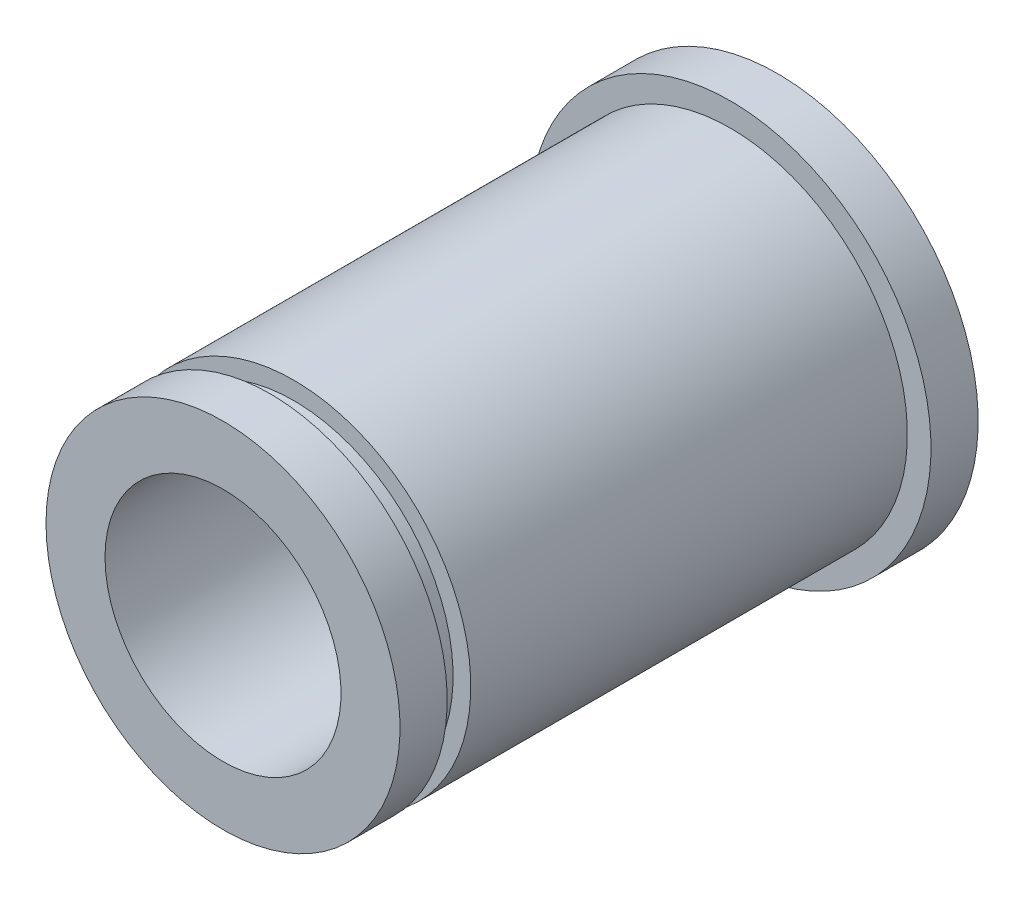
ISO-10303-21;
HEADER;
FILE_DESCRIPTION(('STEP AP214'),'2;1');
FILE_NAME('part.step','',(''),(''),'','','');
FILE_SCHEMA(('AUTOMOTIVE_DESIGN { 1 0 10303 214 1 1 1 1 }'));
ENDSEC;
DATA;
#1=APPLICATION_CONTEXT('core data for automotive mechanical design processes');
#2=APPLICATION_PROTOCOL_DEFINITION('international standard','automotive_design',2000,#1);
#3=PRODUCT_CONTEXT('',#1,'mechanical');
#4=PRODUCT('Part','Part','',(#3));
#5=PRODUCT_RELATED_PRODUCT_CATEGORY('part','',(#4));
#6=PRODUCT_DEFINITION_FORMATION('','',#4);
#7=PRODUCT_DEFINITION_CONTEXT('part definition',#1,'design');
#8=PRODUCT_DEFINITION('design','',#6,#7);
#9=PRODUCT_DEFINITION_SHAPE('','',#8);
#10=(LENGTH_UNIT() NAMED_UNIT(*) SI_UNIT(.MILLI.,.METRE.));
#11=(NAMED_UNIT(*) PLANE_ANGLE_UNIT() SI_UNIT($,.RADIAN.));
#12=(NAMED_UNIT(*) SI_UNIT($,.STERADIAN.) SOLID_ANGLE_UNIT());
#13=UNCERTAINTY_MEASURE_WITH_UNIT(LENGTH_MEASURE(1.E-05),#10,'distance_accuracy_value','');
#14=(GEOMETRIC_REPRESENTATION_CONTEXT(3) GLOBAL_UNCERTAINTY_ASSIGNED_CONTEXT((#13)) GLOBAL_UNIT_ASSIGNED_CONTEXT((#10,
#11,#12)) REPRESENTATION_CONTEXT('',''));
#15=CARTESIAN_POINT('',(0.,0.,0.));
#16=DIRECTION('',(0.,0.,1.));
#17=DIRECTION('',(1.,0.,0.));
#18=AXIS2_PLACEMENT_3D('',#15,#16,#17);
#19=CARTESIAN_POINT('',(8.5,0.,-2.));
#20=DIRECTION('',(0.,0.,1.));
#21=DIRECTION('',(1.,0.,0.));
#22=AXIS2_PLACEMENT_3D('',#19,#20,#21);
#23=PLANE('',#22);
#24=CARTESIAN_POINT('',(0.,0.,-2.));
#25=DIRECTION('',(0.,0.,-1.));
#26=DIRECTION('',(-1.,0.,0.));
#27=AXIS2_PLACEMENT_3D('',#24,#25,#26);
#28=CIRCLE('',#27,5.);
#29=CARTESIAN_POINT('',(-5.,0.,-2.));
#30=VERTEX_POINT('',#29);
#31=EDGE_CURVE('E10',#30,#30,#28,.T.);
#32=ORIENTED_EDGE('',*,*,#31,.F.);
#33=EDGE_LOOP('',(#32));
#34=FACE_BOUND('',#33,.T.);
#35=CARTESIAN_POINT('',(0.,0.,-2.));
#36=DIRECTION('',(0.,0.,-1.));
#37=DIRECTION('',(-1.,0.,0.));
#38=AXIS2_PLACEMENT_3D('',#35,#36,#37);
#39=CIRCLE('',#38,8.5);
#40=CARTESIAN_POINT('',(-8.5,0.,-2.));
#41=VERTEX_POINT('',#40);
#42=EDGE_CURVE('E65',#41,#41,#39,.T.);
#43=ORIENTED_EDGE('',*,*,#42,.T.);
#44=EDGE_LOOP('',(#43));
#45=FACE_BOUND('',#44,.T.);
#46=ADVANCED_FACE('F31',(#34,#45),#23,.F.);
#47=CARTESIAN_POINT('',(0.,0.,-1.43726444645798));
#48=DIRECTION('',(0.,0.,-1.));
#49=DIRECTION('',(-1.,0.,0.));
#50=AXIS2_PLACEMENT_3D('',#47,#48,#49);
#51=CYLINDRICAL_SURFACE('',#50,5.);
#52=CARTESIAN_POINT('',(0.,0.,21.5));
#53=DIRECTION('',(0.,0.,-1.));
#54=DIRECTION('',(-1.,0.,0.));
#55=AXIS2_PLACEMENT_3D('',#52,#53,#54);
#56=CIRCLE('',#55,5.);
#57=CARTESIAN_POINT('',(-5.,0.,21.5));
#58=VERTEX_POINT('',#57);
#59=EDGE_CURVE('E37',#58,#58,#56,.T.);
#60=ORIENTED_EDGE('',*,*,#59,.F.);
#61=EDGE_LOOP('',(#60));
#62=FACE_BOUND('',#61,.T.);
#63=ORIENTED_EDGE('',*,*,#31,.T.);
#64=EDGE_LOOP('',(#63));
#65=FACE_BOUND('',#64,.T.);
#66=ADVANCED_FACE('F114',(#62,#65),#51,.F.);
#67=CARTESIAN_POINT('',(5.,0.,21.5));
#68=DIRECTION('',(0.,0.,-1.));
#69=DIRECTION('',(-1.,0.,0.));
#70=AXIS2_PLACEMENT_3D('',#67,#68,#69);
#71=PLANE('',#70);
#72=CARTESIAN_POINT('',(0.,0.,21.5));
#73=DIRECTION('',(0.,0.,-1.));
#74=DIRECTION('',(-1.,0.,0.));
#75=AXIS2_PLACEMENT_3D('',#72,#73,#74);
#76=CIRCLE('',#75,7.5);
#77=CARTESIAN_POINT('',(-7.49999999999999,0.,21.5));
#78=VERTEX_POINT('',#77);
#79=EDGE_CURVE('E41',#78,#78,#76,.T.);
#80=ORIENTED_EDGE('',*,*,#79,.F.);
#81=EDGE_LOOP('',(#80));
#82=FACE_BOUND('',#81,.T.);
#83=ORIENTED_EDGE('',*,*,#59,.T.);
#84=EDGE_LOOP('',(#83));
#85=FACE_BOUND('',#84,.T.);
#86=ADVANCED_FACE('F109',(#82,#85),#71,.F.);
#87=CARTESIAN_POINT('',(0.,0.,-1.43726444645798));
#88=DIRECTION('',(0.,0.,-1.));
#89=DIRECTION('',(-1.,0.,0.));
#90=AXIS2_PLACEMENT_3D('',#87,#88,#89);
#91=CYLINDRICAL_SURFACE('',#90,7.5);
#92=CARTESIAN_POINT('',(0.,0.,19.5));
#93=DIRECTION('',(0.,0.,-1.));
#94=DIRECTION('',(-1.,0.,0.));
#95=AXIS2_PLACEMENT_3D('',#92,#93,#94);
#96=CIRCLE('',#95,7.5);
#97=CARTESIAN_POINT('',(-7.5,0.,19.5));
#98=VERTEX_POINT('',#97);
#99=EDGE_CURVE('E45',#98,#98,#96,.T.);
#100=ORIENTED_EDGE('',*,*,#99,.F.);
#101=EDGE_LOOP('',(#100));
#102=FACE_BOUND('',#101,.T.);
#103=ORIENTED_EDGE('',*,*,#79,.T.);
#104=EDGE_LOOP('',(#103));
#105=FACE_BOUND('',#104,.T.);
#106=ADVANCED_FACE('F103',(#102,#105),#91,.T.);
#107=CARTESIAN_POINT('',(7.5,0.,19.5));
#108=DIRECTION('',(0.,0.,1.));
#109=DIRECTION('',(1.,0.,0.));
#110=AXIS2_PLACEMENT_3D('',#107,#108,#109);
#111=PLANE('',#110);
#112=CARTESIAN_POINT('',(0.,0.,19.5));
#113=DIRECTION('',(0.,0.,-1.));
#114=DIRECTION('',(-1.,0.,0.));
#115=AXIS2_PLACEMENT_3D('',#112,#113,#114);
#116=CIRCLE('',#115,6.75);
#117=CARTESIAN_POINT('',(-6.75,0.,19.5));
#118=VERTEX_POINT('',#117);
#119=EDGE_CURVE('E50',#118,#118,#116,.T.);
#120=ORIENTED_EDGE('',*,*,#119,.F.);
#121=EDGE_LOOP('',(#120));
#122=FACE_BOUND('',#121,.T.);
#123=ORIENTED_EDGE('',*,*,#99,.T.);
#124=EDGE_LOOP('',(#123));
#125=FACE_BOUND('',#124,.T.);
#126=ADVANCED_FACE('F97',(#122,#125),#111,.F.);
#127=CARTESIAN_POINT('',(0.,0.,-1.43726444645798));
#128=DIRECTION('',(0.,0.,-1.));
#129=DIRECTION('',(-1.,0.,0.));
#130=AXIS2_PLACEMENT_3D('',#127,#128,#129);
#131=CYLINDRICAL_SURFACE('',#130,6.75);
#132=CARTESIAN_POINT('',(0.,0.,18.5));
#133=DIRECTION('',(0.,0.,-1.));
#134=DIRECTION('',(-1.,0.,0.));
#135=AXIS2_PLACEMENT_3D('',#132,#133,#134);
#136=CIRCLE('',#135,6.75);
#137=CARTESIAN_POINT('',(-6.75,0.,18.5));
#138=VERTEX_POINT('',#137);
#139=EDGE_CURVE('E53',#138,#138,#136,.T.);
#140=ORIENTED_EDGE('',*,*,#139,.F.);
#141=EDGE_LOOP('',(#140));
#142=FACE_BOUND('',#141,.T.);
#143=ORIENTED_EDGE('',*,*,#119,.T.);
#144=EDGE_LOOP('',(#143));
#145=FACE_BOUND('',#144,.T.);
#146=ADVANCED_FACE('F91',(#142,#145),#131,.T.);
#147=CARTESIAN_POINT('',(6.75,0.,18.5));
#148=DIRECTION('',(0.,0.,-1.));
#149=DIRECTION('',(-1.,0.,0.));
#150=AXIS2_PLACEMENT_3D('',#147,#148,#149);
#151=PLANE('',#150);
#152=CARTESIAN_POINT('',(0.,0.,18.5));
#153=DIRECTION('',(0.,0.,-1.));
#154=DIRECTION('',(-1.,0.,0.));
#155=AXIS2_PLACEMENT_3D('',#152,#153,#154);
#156=CIRCLE('',#155,7.5);
#157=CARTESIAN_POINT('',(-7.5,0.,18.5));
#158=VERTEX_POINT('',#157);
#159=EDGE_CURVE('E56',#158,#158,#156,.T.);
#160=ORIENTED_EDGE('',*,*,#159,.F.);
#161=EDGE_LOOP('',(#160));
#162=FACE_BOUND('',#161,.T.);
#163=ORIENTED_EDGE('',*,*,#139,.T.);
#164=EDGE_LOOP('',(#163));
#165=FACE_BOUND('',#164,.T.);
#166=ADVANCED_FACE('F85',(#162,#165),#151,.F.);
#167=CARTESIAN_POINT('',(0.,0.,-1.43726444645798));
#168=DIRECTION('',(0.,0.,-1.));
#169=DIRECTION('',(-1.,0.,0.));
#170=AXIS2_PLACEMENT_3D('',#167,#168,#169);
#171=CYLINDRICAL_SURFACE('',#170,7.5);
#172=CARTESIAN_POINT('',(0.,0.,0.));
#173=DIRECTION('',(0.,0.,-1.));
#174=DIRECTION('',(-1.,0.,0.));
#175=AXIS2_PLACEMENT_3D('',#172,#173,#174);
#176=CIRCLE('',#175,7.5);
#177=CARTESIAN_POINT('',(-7.5,0.,0.));
#178=VERTEX_POINT('',#177);
#179=EDGE_CURVE('E59',#178,#178,#176,.T.);
#180=ORIENTED_EDGE('',*,*,#179,.F.);
#181=EDGE_LOOP('',(#180));
#182=FACE_BOUND('',#181,.T.);
#183=ORIENTED_EDGE('',*,*,#159,.T.);
#184=EDGE_LOOP('',(#183));
#185=FACE_BOUND('',#184,.T.);
#186=ADVANCED_FACE('F79',(#182,#185),#171,.T.);
#187=CARTESIAN_POINT('',(7.5,0.,0.));
#188=DIRECTION('',(0.,0.,-1.));
#189=DIRECTION('',(-1.,0.,0.));
#190=AXIS2_PLACEMENT_3D('',#187,#188,#189);
#191=PLANE('',#190);
#192=CARTESIAN_POINT('',(0.,0.,0.));
#193=DIRECTION('',(0.,0.,-1.));
#194=DIRECTION('',(-1.,0.,0.));
#195=AXIS2_PLACEMENT_3D('',#192,#193,#194);
#196=CIRCLE('',#195,8.5);
#197=CARTESIAN_POINT('',(-8.5,0.,0.));
#198=VERTEX_POINT('',#197);
#199=EDGE_CURVE('E62',#198,#198,#196,.T.);
#200=ORIENTED_EDGE('',*,*,#199,.F.);
#201=EDGE_LOOP('',(#200));
#202=FACE_BOUND('',#201,.T.);
#203=ORIENTED_EDGE('',*,*,#179,.T.);
#204=EDGE_LOOP('',(#203));
#205=FACE_BOUND('',#204,.T.);
#206=ADVANCED_FACE('F73',(#202,#205),#191,.F.);
#207=CARTESIAN_POINT('',(0.,0.,-1.43726444645798));
#208=DIRECTION('',(0.,0.,-1.));
#209=DIRECTION('',(-1.,0.,0.));
#210=AXIS2_PLACEMENT_3D('',#207,#208,#209);
#211=CYLINDRICAL_SURFACE('',#210,8.5);
#212=ORIENTED_EDGE('',*,*,#42,.F.);
#213=EDGE_LOOP('',(#212));
#214=FACE_BOUND('',#213,.T.);
#215=ORIENTED_EDGE('',*,*,#199,.T.);
#216=EDGE_LOOP('',(#215));
#217=FACE_BOUND('',#216,.T.);
#218=ADVANCED_FACE('F70',(#214,#217),#211,.T.);
#219=CLOSED_SHELL('',(#46,#66,#86,#106,#126,#146,#166,#186,#206,#218));
#220=MANIFOLD_SOLID_BREP('B2',#219);
#221=ADVANCED_BREP_SHAPE_REPRESENTATION('',(#18,#220),#14);
#222=SHAPE_DEFINITION_REPRESENTATION(#9,#221);
ENDSEC;
END-ISO-10303-21;
